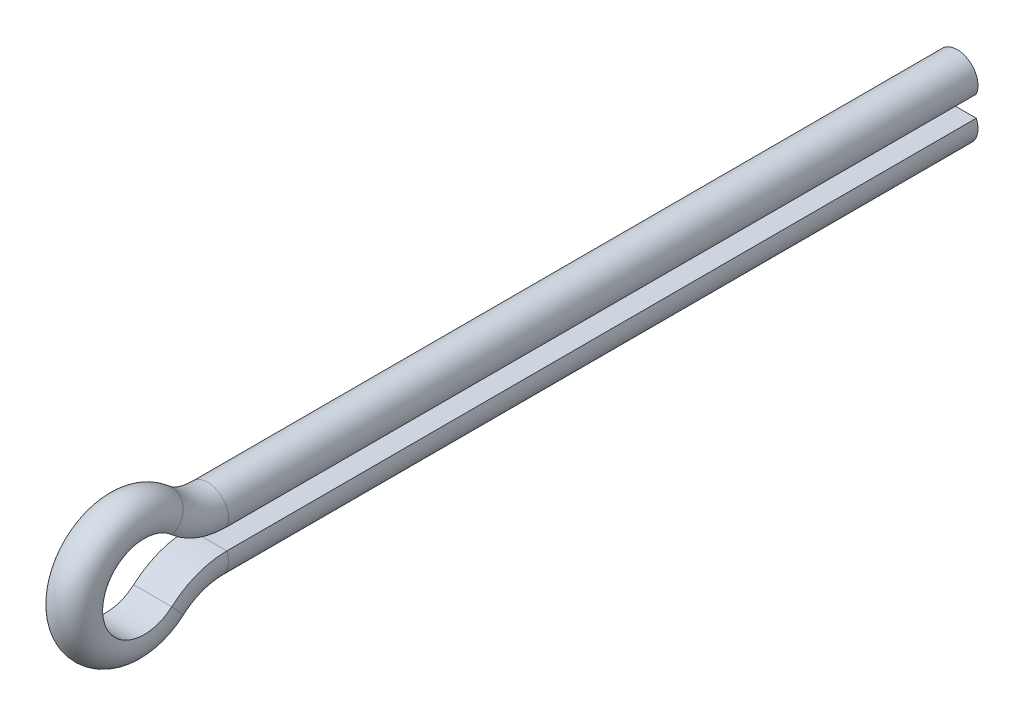
ISO-10303-21;
HEADER;
FILE_DESCRIPTION(('STEP AP214'),'2;1');
FILE_NAME('part.step','',(''),(''),'','','');
FILE_SCHEMA(('AUTOMOTIVE_DESIGN { 1 0 10303 214 1 1 1 1 }'));
ENDSEC;
DATA;
#1=APPLICATION_CONTEXT('core data for automotive mechanical design processes');
#2=APPLICATION_PROTOCOL_DEFINITION('international standard','automotive_design',2000,#1);
#3=PRODUCT_CONTEXT('',#1,'mechanical');
#4=PRODUCT('Part','Part','',(#3));
#5=PRODUCT_RELATED_PRODUCT_CATEGORY('part','',(#4));
#6=PRODUCT_DEFINITION_FORMATION('','',#4);
#7=PRODUCT_DEFINITION_CONTEXT('part definition',#1,'design');
#8=PRODUCT_DEFINITION('design','',#6,#7);
#9=PRODUCT_DEFINITION_SHAPE('','',#8);
#10=(LENGTH_UNIT() NAMED_UNIT(*) SI_UNIT(.MILLI.,.METRE.));
#11=(NAMED_UNIT(*) PLANE_ANGLE_UNIT() SI_UNIT($,.RADIAN.));
#12=(NAMED_UNIT(*) SI_UNIT($,.STERADIAN.) SOLID_ANGLE_UNIT());
#13=UNCERTAINTY_MEASURE_WITH_UNIT(LENGTH_MEASURE(1.E-05),#10,'distance_accuracy_value','');
#14=(GEOMETRIC_REPRESENTATION_CONTEXT(3) GLOBAL_UNCERTAINTY_ASSIGNED_CONTEXT((#13)) GLOBAL_UNIT_ASSIGNED_CONTEXT((#10,
#11,#12)) REPRESENTATION_CONTEXT('',''));
#15=CARTESIAN_POINT('',(0.,0.,0.));
#16=DIRECTION('',(0.,0.,1.));
#17=DIRECTION('',(1.,0.,0.));
#18=AXIS2_PLACEMENT_3D('',#15,#16,#17);
#19=CARTESIAN_POINT('',(0.,-1.,0.));
#20=DIRECTION('',(0.,0.,1.));
#21=DIRECTION('',(1.,0.,0.));
#22=AXIS2_PLACEMENT_3D('',#19,#20,#21);
#23=PLANE('',#22);
#24=CARTESIAN_POINT('',(0.,-1.,0.));
#25=DIRECTION('',(0.,0.,1.));
#26=DIRECTION('',(1.,0.,0.));
#27=AXIS2_PLACEMENT_3D('',#24,#25,#26);
#28=CIRCLE('',#27,2.5);
#29=CARTESIAN_POINT('',(-2.29128784747792,0.,0.));
#30=VERTEX_POINT('',#29);
#31=CARTESIAN_POINT('',(2.29128784747792,0.,0.));
#32=VERTEX_POINT('',#31);
#33=EDGE_CURVE('E92',#30,#32,#28,.T.);
#34=ORIENTED_EDGE('',*,*,#33,.F.);
#35=DIRECTION('',(-1.,0.,0.));
#36=VECTOR('',#35,1.);
#37=CARTESIAN_POINT('',(-2.29128784747792,0.,0.));
#38=LINE('',#37,#36);
#39=EDGE_CURVE('E94',#32,#30,#38,.T.);
#40=ORIENTED_EDGE('',*,*,#39,.F.);
#41=EDGE_LOOP('',(#34,#40));
#42=FACE_BOUND('',#41,.T.);
#43=ADVANCED_FACE('F45',(#42),#23,.F.);
#44=CARTESIAN_POINT('',(0.,3.5,0.));
#45=DIRECTION('',(0.,0.,-1.));
#46=DIRECTION('',(1.,0.,0.));
#47=AXIS2_PLACEMENT_3D('',#44,#45,#46);
#48=PLANE('',#47);
#49=CARTESIAN_POINT('',(0.,3.5,0.));
#50=DIRECTION('',(0.,0.,-1.));
#51=DIRECTION('',(1.,0.,0.));
#52=AXIS2_PLACEMENT_3D('',#49,#50,#51);
#53=CIRCLE('',#52,2.5);
#54=CARTESIAN_POINT('',(-2.29128784747792,2.5,0.));
#55=VERTEX_POINT('',#54);
#56=CARTESIAN_POINT('',(2.29128784747792,2.5,0.));
#57=VERTEX_POINT('',#56);
#58=EDGE_CURVE('E58',#55,#57,#53,.T.);
#59=ORIENTED_EDGE('',*,*,#58,.T.);
#60=DIRECTION('',(-1.,0.,0.));
#61=VECTOR('',#60,1.);
#62=CARTESIAN_POINT('',(-2.29128784747792,2.5,0.));
#63=LINE('',#62,#61);
#64=EDGE_CURVE('E11',#57,#55,#63,.T.);
#65=ORIENTED_EDGE('',*,*,#64,.T.);
#66=EDGE_LOOP('',(#59,#65));
#67=FACE_BOUND('',#66,.T.);
#68=ADVANCED_FACE('F218',(#67),#48,.T.);
#69=CARTESIAN_POINT('',(0.,-1.,0.));
#70=DIRECTION('',(0.,0.,1.));
#71=DIRECTION('',(1.,0.,0.));
#72=AXIS2_PLACEMENT_3D('',#69,#70,#71);
#73=CYLINDRICAL_SURFACE('',#72,2.5);
#74=DIRECTION('',(0.,0.,1.));
#75=VECTOR('',#74,1.);
#76=CARTESIAN_POINT('',(2.29128784747792,0.,0.));
#77=LINE('',#76,#75);
#78=CARTESIAN_POINT('',(2.29128784747792,0.,90.0784325835078));
#79=VERTEX_POINT('',#78);
#80=EDGE_CURVE('E106',#32,#79,#77,.T.);
#81=ORIENTED_EDGE('',*,*,#80,.T.);
#82=CARTESIAN_POINT('',(0.,-1.,90.0784325835078));
#83=DIRECTION('',(0.,0.,1.));
#84=DIRECTION('',(1.,0.,0.));
#85=AXIS2_PLACEMENT_3D('',#82,#83,#84);
#86=CIRCLE('',#85,2.5);
#87=CARTESIAN_POINT('',(-2.29128784747792,0.,90.0784325835078));
#88=VERTEX_POINT('',#87);
#89=EDGE_CURVE('E112',#88,#79,#86,.T.);
#90=ORIENTED_EDGE('',*,*,#89,.F.);
#91=DIRECTION('',(0.,0.,1.));
#92=VECTOR('',#91,1.);
#93=CARTESIAN_POINT('',(-2.29128784747792,0.,0.));
#94=LINE('',#93,#92);
#95=EDGE_CURVE('E105',#30,#88,#94,.T.);
#96=ORIENTED_EDGE('',*,*,#95,.F.);
#97=ORIENTED_EDGE('',*,*,#33,.T.);
#98=EDGE_LOOP('',(#81,#90,#96,#97));
#99=FACE_BOUND('',#98,.T.);
#100=ADVANCED_FACE('F110',(#99),#73,.T.);
#101=CARTESIAN_POINT('',(-2.29128784747792,0.,0.));
#102=DIRECTION('',(0.,1.,0.));
#103=DIRECTION('',(-1.,0.,0.));
#104=AXIS2_PLACEMENT_3D('',#101,#102,#103);
#105=PLANE('',#104);
#106=DIRECTION('',(-1.,0.,0.));
#107=VECTOR('',#106,1.);
#108=CARTESIAN_POINT('',(-2.29128784747792,0.,90.0784325835078));
#109=LINE('',#108,#107);
#110=EDGE_CURVE('E132',#79,#88,#109,.T.);
#111=ORIENTED_EDGE('',*,*,#110,.F.);
#112=ORIENTED_EDGE('',*,*,#80,.F.);
#113=ORIENTED_EDGE('',*,*,#39,.T.);
#114=ORIENTED_EDGE('',*,*,#95,.T.);
#115=EDGE_LOOP('',(#111,#112,#113,#114));
#116=FACE_BOUND('',#115,.T.);
#117=ADVANCED_FACE('F104',(#116),#105,.T.);
#118=CARTESIAN_POINT('',(0.,-10.,90.0784325835078));
#119=DIRECTION('',(1.,0.,0.));
#120=DIRECTION('',(0.,0.,-1.));
#121=AXIS2_PLACEMENT_3D('',#118,#119,#120);
#122=TOROIDAL_SURFACE('',#121,9.,2.5);
#123=CARTESIAN_POINT('',(2.29128784747792,-10.,90.0784325835078));
#124=DIRECTION('',(1.,0.,0.));
#125=DIRECTION('',(0.,1.,0.));
#126=AXIS2_PLACEMENT_3D('',#123,#124,#125);
#127=CIRCLE('',#126,10.);
#128=CARTESIAN_POINT('',(2.29128784747792,-2.49999999999999,96.6928108611693));
#129=VERTEX_POINT('',#128);
#130=EDGE_CURVE('E123',#79,#129,#127,.T.);
#131=ORIENTED_EDGE('',*,*,#130,.T.);
#132=CARTESIAN_POINT('',(0.,-3.25,96.0313730334031));
#133=DIRECTION('',(0.,-0.661437827766147,0.750000000000001));
#134=DIRECTION('',(1.,0.,0.));
#135=AXIS2_PLACEMENT_3D('',#132,#133,#134);
#136=CIRCLE('',#135,2.5);
#137=CARTESIAN_POINT('',(-2.29128784747792,-2.49999999999999,96.6928108611693));
#138=VERTEX_POINT('',#137);
#139=EDGE_CURVE('E119',#138,#129,#136,.T.);
#140=ORIENTED_EDGE('',*,*,#139,.F.);
#141=CARTESIAN_POINT('',(-2.29128784747792,-10.,90.0784325835078));
#142=DIRECTION('',(1.,0.,0.));
#143=DIRECTION('',(0.,1.,0.));
#144=AXIS2_PLACEMENT_3D('',#141,#142,#143);
#145=CIRCLE('',#144,10.);
#146=EDGE_CURVE('E124',#88,#138,#145,.T.);
#147=ORIENTED_EDGE('',*,*,#146,.F.);
#148=ORIENTED_EDGE('',*,*,#89,.T.);
#149=EDGE_LOOP('',(#131,#140,#147,#148));
#150=FACE_BOUND('',#149,.T.);
#151=ADVANCED_FACE('F197',(#150),#122,.T.);
#152=CARTESIAN_POINT('',(0.,-10.,90.0784325835078));
#153=DIRECTION('',(1.,0.,0.));
#154=DIRECTION('',(0.,0.,-1.));
#155=AXIS2_PLACEMENT_3D('',#152,#153,#154);
#156=CYLINDRICAL_SURFACE('',#155,10.);
#157=DIRECTION('',(-1.,0.,0.));
#158=VECTOR('',#157,1.);
#159=CARTESIAN_POINT('',(-2.29128784747792,-2.5,96.6928108611693));
#160=LINE('',#159,#158);
#161=EDGE_CURVE('E128',#129,#138,#160,.T.);
#162=ORIENTED_EDGE('',*,*,#161,.F.);
#163=ORIENTED_EDGE('',*,*,#130,.F.);
#164=ORIENTED_EDGE('',*,*,#110,.T.);
#165=ORIENTED_EDGE('',*,*,#146,.T.);
#166=EDGE_LOOP('',(#162,#163,#164,#165));
#167=FACE_BOUND('',#166,.T.);
#168=ADVANCED_FACE('F198',(#167),#156,.T.);
#169=CARTESIAN_POINT('',(0.,1.25,100.));
#170=DIRECTION('',(-1.,0.,0.));
#171=DIRECTION('',(0.,0.,1.));
#172=AXIS2_PLACEMENT_3D('',#169,#170,#171);
#173=TOROIDAL_SURFACE('',#172,6.,2.5);
#174=CARTESIAN_POINT('',(2.29128784747792,1.25,100.));
#175=DIRECTION('',(-1.,0.,0.));
#176=DIRECTION('',(0.,-0.75,-0.661437827766148));
#177=AXIS2_PLACEMENT_3D('',#174,#175,#176);
#178=CIRCLE('',#177,5.);
#179=CARTESIAN_POINT('',(2.29128784747792,5.,96.6928108611693));
#180=VERTEX_POINT('',#179);
#181=EDGE_CURVE('E137',#129,#180,#178,.T.);
#182=ORIENTED_EDGE('',*,*,#181,.T.);
#183=CARTESIAN_POINT('',(0.,5.75,96.0313730334031));
#184=DIRECTION('',(0.,-0.661437827766148,-0.75));
#185=DIRECTION('',(1.,0.,0.));
#186=AXIS2_PLACEMENT_3D('',#183,#184,#185);
#187=CIRCLE('',#186,2.5);
#188=CARTESIAN_POINT('',(-2.29128784747792,5.,96.6928108611693));
#189=VERTEX_POINT('',#188);
#190=EDGE_CURVE('E133',#189,#180,#187,.T.);
#191=ORIENTED_EDGE('',*,*,#190,.F.);
#192=CARTESIAN_POINT('',(-2.29128784747792,1.25,100.));
#193=DIRECTION('',(-1.,0.,0.));
#194=DIRECTION('',(0.,-0.75,-0.661437827766148));
#195=AXIS2_PLACEMENT_3D('',#192,#193,#194);
#196=CIRCLE('',#195,5.);
#197=EDGE_CURVE('E138',#138,#189,#196,.T.);
#198=ORIENTED_EDGE('',*,*,#197,.F.);
#199=ORIENTED_EDGE('',*,*,#139,.T.);
#200=EDGE_LOOP('',(#182,#191,#198,#199));
#201=FACE_BOUND('',#200,.T.);
#202=ADVANCED_FACE('F191',(#201),#173,.T.);
#203=CARTESIAN_POINT('',(0.,1.25,100.));
#204=DIRECTION('',(-1.,0.,0.));
#205=DIRECTION('',(0.,0.,1.));
#206=AXIS2_PLACEMENT_3D('',#203,#204,#205);
#207=CYLINDRICAL_SURFACE('',#206,5.);
#208=DIRECTION('',(-1.,0.,0.));
#209=VECTOR('',#208,1.);
#210=CARTESIAN_POINT('',(-2.29128784747792,5.,96.6928108611693));
#211=LINE('',#210,#209);
#212=EDGE_CURVE('E142',#180,#189,#211,.T.);
#213=ORIENTED_EDGE('',*,*,#212,.F.);
#214=ORIENTED_EDGE('',*,*,#181,.F.);
#215=ORIENTED_EDGE('',*,*,#161,.T.);
#216=ORIENTED_EDGE('',*,*,#197,.T.);
#217=EDGE_LOOP('',(#213,#214,#215,#216));
#218=FACE_BOUND('',#217,.T.);
#219=ADVANCED_FACE('F192',(#218),#207,.F.);
#220=CARTESIAN_POINT('',(0.,12.5,90.0784325835078));
#221=DIRECTION('',(1.,0.,0.));
#222=DIRECTION('',(0.,0.,-1.));
#223=AXIS2_PLACEMENT_3D('',#220,#221,#222);
#224=TOROIDAL_SURFACE('',#223,9.,2.5);
#225=CARTESIAN_POINT('',(2.29128784747792,12.5,90.0784325835078));
#226=DIRECTION('',(1.,0.,0.));
#227=DIRECTION('',(0.,-0.750000000000001,0.661437827766147));
#228=AXIS2_PLACEMENT_3D('',#225,#226,#227);
#229=CIRCLE('',#228,10.);
#230=CARTESIAN_POINT('',(2.29128784747792,2.5,90.0784325835078));
#231=VERTEX_POINT('',#230);
#232=EDGE_CURVE('E150',#180,#231,#229,.T.);
#233=ORIENTED_EDGE('',*,*,#232,.T.);
#234=CARTESIAN_POINT('',(0.,3.5,90.0784325835078));
#235=DIRECTION('',(0.,0.,-1.));
#236=DIRECTION('',(1.,0.,0.));
#237=AXIS2_PLACEMENT_3D('',#234,#235,#236);
#238=CIRCLE('',#237,2.5);
#239=CARTESIAN_POINT('',(-2.29128784747792,2.5,90.0784325835078));
#240=VERTEX_POINT('',#239);
#241=EDGE_CURVE('E146',#240,#231,#238,.T.);
#242=ORIENTED_EDGE('',*,*,#241,.F.);
#243=CARTESIAN_POINT('',(-2.29128784747792,12.5,90.0784325835078));
#244=DIRECTION('',(1.,0.,0.));
#245=DIRECTION('',(0.,-0.750000000000001,0.661437827766147));
#246=AXIS2_PLACEMENT_3D('',#243,#244,#245);
#247=CIRCLE('',#246,10.);
#248=EDGE_CURVE('E151',#189,#240,#247,.T.);
#249=ORIENTED_EDGE('',*,*,#248,.F.);
#250=ORIENTED_EDGE('',*,*,#190,.T.);
#251=EDGE_LOOP('',(#233,#242,#249,#250));
#252=FACE_BOUND('',#251,.T.);
#253=ADVANCED_FACE('F184',(#252),#224,.T.);
#254=CARTESIAN_POINT('',(0.,12.5,90.0784325835078));
#255=DIRECTION('',(1.,0.,0.));
#256=DIRECTION('',(0.,0.,-1.));
#257=AXIS2_PLACEMENT_3D('',#254,#255,#256);
#258=CYLINDRICAL_SURFACE('',#257,10.);
#259=DIRECTION('',(-1.,0.,0.));
#260=VECTOR('',#259,1.);
#261=CARTESIAN_POINT('',(-2.29128784747792,2.5,90.0784325835078));
#262=LINE('',#261,#260);
#263=EDGE_CURVE('E155',#231,#240,#262,.T.);
#264=ORIENTED_EDGE('',*,*,#263,.F.);
#265=ORIENTED_EDGE('',*,*,#232,.F.);
#266=ORIENTED_EDGE('',*,*,#212,.T.);
#267=ORIENTED_EDGE('',*,*,#248,.T.);
#268=EDGE_LOOP('',(#264,#265,#266,#267));
#269=FACE_BOUND('',#268,.T.);
#270=ADVANCED_FACE('F186',(#269),#258,.T.);
#271=CARTESIAN_POINT('',(0.,3.5,90.0784325835078));
#272=DIRECTION('',(0.,0.,-1.));
#273=DIRECTION('',(0.,1.,0.));
#274=AXIS2_PLACEMENT_3D('',#271,#272,#273);
#275=CYLINDRICAL_SURFACE('',#274,2.5);
#276=DIRECTION('',(0.,0.,-1.));
#277=VECTOR('',#276,1.);
#278=CARTESIAN_POINT('',(2.29128784747792,2.5,90.0784325835078));
#279=LINE('',#278,#277);
#280=EDGE_CURVE('E53',#231,#57,#279,.T.);
#281=ORIENTED_EDGE('',*,*,#280,.T.);
#282=ORIENTED_EDGE('',*,*,#58,.F.);
#283=DIRECTION('',(0.,0.,-1.));
#284=VECTOR('',#283,1.);
#285=CARTESIAN_POINT('',(-2.29128784747792,2.5,90.0784325835078));
#286=LINE('',#285,#284);
#287=EDGE_CURVE('E161',#240,#55,#286,.T.);
#288=ORIENTED_EDGE('',*,*,#287,.F.);
#289=ORIENTED_EDGE('',*,*,#241,.T.);
#290=EDGE_LOOP('',(#281,#282,#288,#289));
#291=FACE_BOUND('',#290,.T.);
#292=ADVANCED_FACE('F211',(#291),#275,.T.);
#293=CARTESIAN_POINT('',(-2.29128784747792,2.5,90.0784325835078));
#294=DIRECTION('',(0.,-1.,0.));
#295=DIRECTION('',(1.,0.,0.));
#296=AXIS2_PLACEMENT_3D('',#293,#294,#295);
#297=PLANE('',#296);
#298=ORIENTED_EDGE('',*,*,#64,.F.);
#299=ORIENTED_EDGE('',*,*,#280,.F.);
#300=ORIENTED_EDGE('',*,*,#263,.T.);
#301=ORIENTED_EDGE('',*,*,#287,.T.);
#302=EDGE_LOOP('',(#298,#299,#300,#301));
#303=FACE_BOUND('',#302,.T.);
#304=ADVANCED_FACE('F181',(#303),#297,.T.);
#305=CLOSED_SHELL('',(#43,#68,#100,#117,#151,#168,#202,#219,#253,#270,#292,#304));
#306=MANIFOLD_SOLID_BREP('B2',#305);
#307=ADVANCED_BREP_SHAPE_REPRESENTATION('',(#18,#306),#14);
#308=SHAPE_DEFINITION_REPRESENTATION(#9,#307);
ENDSEC;
END-ISO-10303-21;
